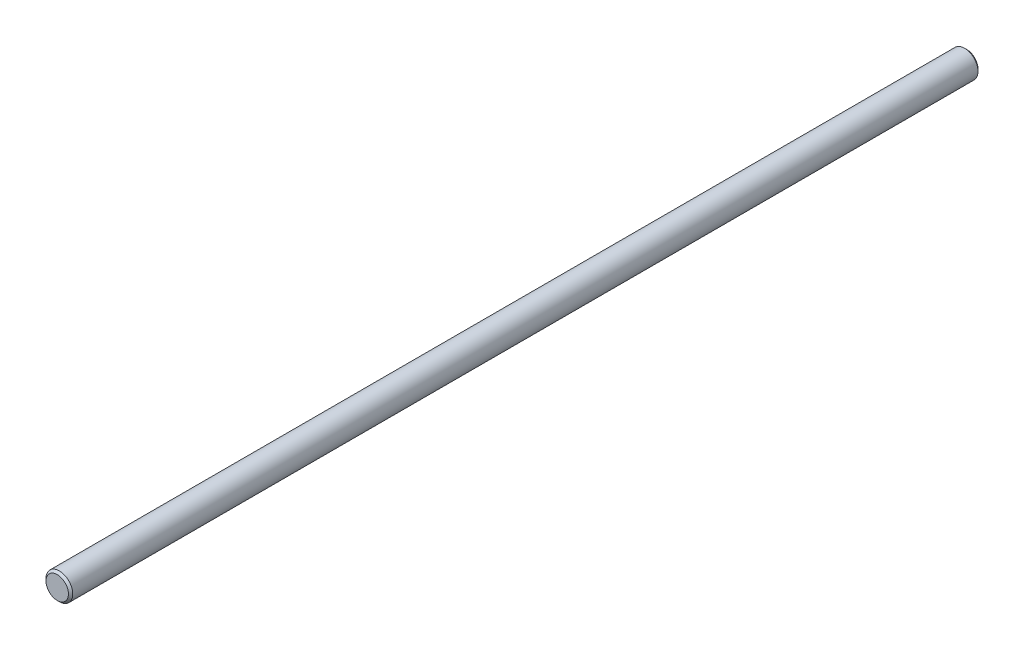
ISO-10303-21;
HEADER;
FILE_DESCRIPTION(('STEP AP214'),'2;1');
FILE_NAME('part.step','',(''),(''),'','','');
FILE_SCHEMA(('AUTOMOTIVE_DESIGN { 1 0 10303 214 1 1 1 1 }'));
ENDSEC;
DATA;
#1=APPLICATION_CONTEXT('core data for automotive mechanical design processes');
#2=APPLICATION_PROTOCOL_DEFINITION('international standard','automotive_design',2000,#1);
#3=PRODUCT_CONTEXT('',#1,'mechanical');
#4=PRODUCT('Part','Part','',(#3));
#5=PRODUCT_RELATED_PRODUCT_CATEGORY('part','',(#4));
#6=PRODUCT_DEFINITION_FORMATION('','',#4);
#7=PRODUCT_DEFINITION_CONTEXT('part definition',#1,'design');
#8=PRODUCT_DEFINITION('design','',#6,#7);
#9=PRODUCT_DEFINITION_SHAPE('','',#8);
#10=(LENGTH_UNIT() NAMED_UNIT(*) SI_UNIT(.MILLI.,.METRE.));
#11=(NAMED_UNIT(*) PLANE_ANGLE_UNIT() SI_UNIT($,.RADIAN.));
#12=(NAMED_UNIT(*) SI_UNIT($,.STERADIAN.) SOLID_ANGLE_UNIT());
#13=UNCERTAINTY_MEASURE_WITH_UNIT(LENGTH_MEASURE(1.E-05),#10,'distance_accuracy_value','');
#14=(GEOMETRIC_REPRESENTATION_CONTEXT(3) GLOBAL_UNCERTAINTY_ASSIGNED_CONTEXT((#13)) GLOBAL_UNIT_ASSIGNED_CONTEXT((#10,
#11,#12)) REPRESENTATION_CONTEXT('',''));
#15=CARTESIAN_POINT('',(0.,0.,0.));
#16=DIRECTION('',(0.,0.,1.));
#17=DIRECTION('',(1.,0.,0.));
#18=AXIS2_PLACEMENT_3D('',#15,#16,#17);
#19=CARTESIAN_POINT('',(0.,0.,85.));
#20=DIRECTION('',(0.,0.,-1.));
#21=DIRECTION('',(-1.,0.,0.));
#22=AXIS2_PLACEMENT_3D('',#19,#20,#21);
#23=CYLINDRICAL_SURFACE('',#22,2.5);
#24=CARTESIAN_POINT('',(0.,0.,-84.6));
#25=DIRECTION('',(0.,0.,1.));
#26=DIRECTION('',(1.,0.,0.));
#27=AXIS2_PLACEMENT_3D('',#24,#25,#26);
#28=CIRCLE('',#27,2.5);
#29=CARTESIAN_POINT('',(2.5,0.,-84.6));
#30=VERTEX_POINT('',#29);
#31=EDGE_CURVE('E48',#30,#30,#28,.T.);
#32=ORIENTED_EDGE('',*,*,#31,.T.);
#33=EDGE_LOOP('',(#32));
#34=FACE_BOUND('',#33,.T.);
#35=CARTESIAN_POINT('',(0.,0.,84.6));
#36=DIRECTION('',(0.,0.,1.));
#37=DIRECTION('',(1.,0.,0.));
#38=AXIS2_PLACEMENT_3D('',#35,#36,#37);
#39=CIRCLE('',#38,2.5);
#40=CARTESIAN_POINT('',(2.5,0.,84.6));
#41=VERTEX_POINT('',#40);
#42=EDGE_CURVE('E52',#41,#41,#39,.F.);
#43=ORIENTED_EDGE('',*,*,#42,.T.);
#44=EDGE_LOOP('',(#43));
#45=FACE_BOUND('',#44,.T.);
#46=ADVANCED_FACE('F37',(#34,#45),#23,.T.);
#47=CARTESIAN_POINT('',(0.,0.,85.));
#48=DIRECTION('',(0.,0.,1.));
#49=DIRECTION('',(1.,0.,0.));
#50=AXIS2_PLACEMENT_3D('',#47,#48,#49);
#51=PLANE('',#50);
#52=CARTESIAN_POINT('',(0.,0.,85.));
#53=DIRECTION('',(0.,0.,1.));
#54=DIRECTION('',(1.,0.,0.));
#55=AXIS2_PLACEMENT_3D('',#52,#53,#54);
#56=CIRCLE('',#55,2.1);
#57=CARTESIAN_POINT('',(2.1,0.,85.));
#58=VERTEX_POINT('',#57);
#59=EDGE_CURVE('E10',#58,#58,#56,.T.);
#60=ORIENTED_EDGE('',*,*,#59,.T.);
#61=EDGE_LOOP('',(#60));
#62=FACE_BOUND('',#61,.T.);
#63=ADVANCED_FACE('F68',(#62),#51,.T.);
#64=CARTESIAN_POINT('',(0.,0.,-85.));
#65=DIRECTION('',(0.,0.,1.));
#66=DIRECTION('',(1.,0.,0.));
#67=AXIS2_PLACEMENT_3D('',#64,#65,#66);
#68=PLANE('',#67);
#69=CARTESIAN_POINT('',(0.,0.,-85.));
#70=DIRECTION('',(0.,0.,1.));
#71=DIRECTION('',(1.,0.,0.));
#72=AXIS2_PLACEMENT_3D('',#69,#70,#71);
#73=CIRCLE('',#72,2.10000000000003);
#74=CARTESIAN_POINT('',(2.10000000000003,0.,-85.));
#75=VERTEX_POINT('',#74);
#76=EDGE_CURVE('E44',#75,#75,#73,.F.);
#77=ORIENTED_EDGE('',*,*,#76,.T.);
#78=EDGE_LOOP('',(#77));
#79=FACE_BOUND('',#78,.T.);
#80=ADVANCED_FACE('F65',(#79),#68,.F.);
#81=CARTESIAN_POINT('',(0.,0.,-84.6));
#82=DIRECTION('',(0.,0.,1.));
#83=DIRECTION('',(1.,0.,0.));
#84=AXIS2_PLACEMENT_3D('',#81,#82,#83);
#85=CONICAL_SURFACE('',#84,2.5,0.785398163397429);
#86=ORIENTED_EDGE('',*,*,#76,.F.);
#87=EDGE_LOOP('',(#86));
#88=FACE_BOUND('',#87,.T.);
#89=ORIENTED_EDGE('',*,*,#31,.F.);
#90=EDGE_LOOP('',(#89));
#91=FACE_BOUND('',#90,.T.);
#92=ADVANCED_FACE('F61',(#88,#91),#85,.T.);
#93=CARTESIAN_POINT('',(0.,0.,85.));
#94=DIRECTION('',(0.,0.,-1.));
#95=DIRECTION('',(-1.,0.,0.));
#96=AXIS2_PLACEMENT_3D('',#93,#94,#95);
#97=CONICAL_SURFACE('',#96,2.1,0.785398163397429);
#98=ORIENTED_EDGE('',*,*,#42,.F.);
#99=EDGE_LOOP('',(#98));
#100=FACE_BOUND('',#99,.T.);
#101=ORIENTED_EDGE('',*,*,#59,.F.);
#102=EDGE_LOOP('',(#101));
#103=FACE_BOUND('',#102,.T.);
#104=ADVANCED_FACE('F39',(#100,#103),#97,.T.);
#105=CLOSED_SHELL('',(#46,#63,#80,#92,#104));
#106=MANIFOLD_SOLID_BREP('B2',#105);
#107=ADVANCED_BREP_SHAPE_REPRESENTATION('',(#18,#106),#14);
#108=SHAPE_DEFINITION_REPRESENTATION(#9,#107);
ENDSEC;
END-ISO-10303-21;
